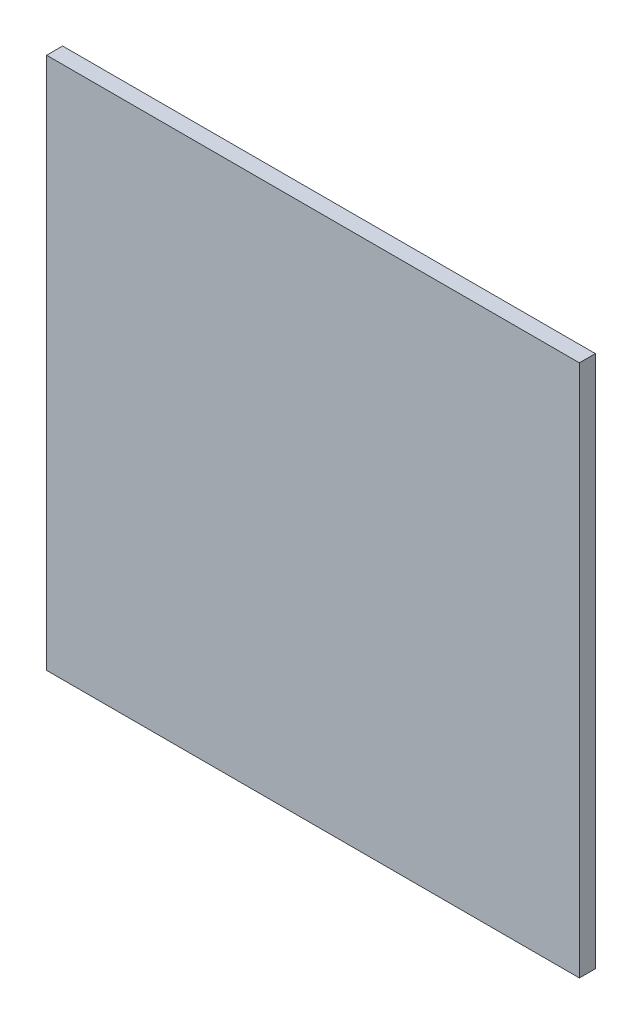
ISO-10303-21;
HEADER;
FILE_DESCRIPTION(('STEP AP214'),'2;1');
FILE_NAME('part.step','',(''),(''),'','','');
FILE_SCHEMA(('AUTOMOTIVE_DESIGN { 1 0 10303 214 1 1 1 1 }'));
ENDSEC;
DATA;
#1=APPLICATION_CONTEXT('core data for automotive mechanical design processes');
#2=APPLICATION_PROTOCOL_DEFINITION('international standard','automotive_design',2000,#1);
#3=PRODUCT_CONTEXT('',#1,'mechanical');
#4=PRODUCT('Part','Part','',(#3));
#5=PRODUCT_RELATED_PRODUCT_CATEGORY('part','',(#4));
#6=PRODUCT_DEFINITION_FORMATION('','',#4);
#7=PRODUCT_DEFINITION_CONTEXT('part definition',#1,'design');
#8=PRODUCT_DEFINITION('design','',#6,#7);
#9=PRODUCT_DEFINITION_SHAPE('','',#8);
#10=(LENGTH_UNIT() NAMED_UNIT(*) SI_UNIT(.MILLI.,.METRE.));
#11=(NAMED_UNIT(*) PLANE_ANGLE_UNIT() SI_UNIT($,.RADIAN.));
#12=(NAMED_UNIT(*) SI_UNIT($,.STERADIAN.) SOLID_ANGLE_UNIT());
#13=UNCERTAINTY_MEASURE_WITH_UNIT(LENGTH_MEASURE(1.E-05),#10,'distance_accuracy_value','');
#14=(GEOMETRIC_REPRESENTATION_CONTEXT(3) GLOBAL_UNCERTAINTY_ASSIGNED_CONTEXT((#13)) GLOBAL_UNIT_ASSIGNED_CONTEXT((#10,
#11,#12)) REPRESENTATION_CONTEXT('',''));
#15=CARTESIAN_POINT('',(0.,0.,0.));
#16=DIRECTION('',(0.,0.,1.));
#17=DIRECTION('',(1.,0.,0.));
#18=AXIS2_PLACEMENT_3D('',#15,#16,#17);
#19=CARTESIAN_POINT('',(50.,50.,3.));
#20=DIRECTION('',(-1.,0.,0.));
#21=DIRECTION('',(0.,-1.,0.));
#22=AXIS2_PLACEMENT_3D('',#19,#20,#21);
#23=PLANE('',#22);
#24=DIRECTION('',(0.,1.,0.));
#25=VECTOR('',#24,1.);
#26=CARTESIAN_POINT('',(50.,50.,0.));
#27=LINE('',#26,#25);
#28=CARTESIAN_POINT('',(50.,-50.,0.));
#29=VERTEX_POINT('',#28);
#30=CARTESIAN_POINT('',(50.,50.,0.));
#31=VERTEX_POINT('',#30);
#32=EDGE_CURVE('E100',#29,#31,#27,.T.);
#33=ORIENTED_EDGE('',*,*,#32,.T.);
#34=DIRECTION('',(0.,0.,-1.));
#35=VECTOR('',#34,1.);
#36=CARTESIAN_POINT('',(50.,50.,3.));
#37=LINE('',#36,#35);
#38=CARTESIAN_POINT('',(50.,50.,3.));
#39=VERTEX_POINT('',#38);
#40=EDGE_CURVE('E11',#39,#31,#37,.T.);
#41=ORIENTED_EDGE('',*,*,#40,.F.);
#42=DIRECTION('',(0.,1.,0.));
#43=VECTOR('',#42,1.);
#44=CARTESIAN_POINT('',(50.,50.,3.));
#45=LINE('',#44,#43);
#46=CARTESIAN_POINT('',(50.,-50.,3.));
#47=VERTEX_POINT('',#46);
#48=EDGE_CURVE('E88',#47,#39,#45,.T.);
#49=ORIENTED_EDGE('',*,*,#48,.F.);
#50=DIRECTION('',(0.,0.,-1.));
#51=VECTOR('',#50,1.);
#52=CARTESIAN_POINT('',(50.,-50.,3.));
#53=LINE('',#52,#51);
#54=EDGE_CURVE('E96',#47,#29,#53,.T.);
#55=ORIENTED_EDGE('',*,*,#54,.T.);
#56=EDGE_LOOP('',(#33,#41,#49,#55));
#57=FACE_BOUND('',#56,.T.);
#58=ADVANCED_FACE('F37',(#57),#23,.F.);
#59=CARTESIAN_POINT('',(-50.,50.,3.));
#60=DIRECTION('',(0.,-1.,0.));
#61=DIRECTION('',(0.,0.,-1.));
#62=AXIS2_PLACEMENT_3D('',#59,#60,#61);
#63=PLANE('',#62);
#64=DIRECTION('',(-1.,0.,0.));
#65=VECTOR('',#64,1.);
#66=CARTESIAN_POINT('',(-50.,50.,0.));
#67=LINE('',#66,#65);
#68=CARTESIAN_POINT('',(-50.,50.,0.));
#69=VERTEX_POINT('',#68);
#70=EDGE_CURVE('E92',#31,#69,#67,.T.);
#71=ORIENTED_EDGE('',*,*,#70,.T.);
#72=DIRECTION('',(0.,0.,-1.));
#73=VECTOR('',#72,1.);
#74=CARTESIAN_POINT('',(-50.,50.,3.));
#75=LINE('',#74,#73);
#76=CARTESIAN_POINT('',(-50.,50.,3.));
#77=VERTEX_POINT('',#76);
#78=EDGE_CURVE('E45',#77,#69,#75,.T.);
#79=ORIENTED_EDGE('',*,*,#78,.F.);
#80=DIRECTION('',(-1.,0.,0.));
#81=VECTOR('',#80,1.);
#82=CARTESIAN_POINT('',(-50.,50.,3.));
#83=LINE('',#82,#81);
#84=EDGE_CURVE('E83',#39,#77,#83,.T.);
#85=ORIENTED_EDGE('',*,*,#84,.F.);
#86=ORIENTED_EDGE('',*,*,#40,.T.);
#87=EDGE_LOOP('',(#71,#79,#85,#86));
#88=FACE_BOUND('',#87,.T.);
#89=ADVANCED_FACE('F91',(#88),#63,.F.);
#90=CARTESIAN_POINT('',(-50.,50.,3.));
#91=DIRECTION('',(1.,0.,0.));
#92=DIRECTION('',(0.,1.,0.));
#93=AXIS2_PLACEMENT_3D('',#90,#91,#92);
#94=PLANE('',#93);
#95=DIRECTION('',(0.,-1.,0.));
#96=VECTOR('',#95,1.);
#97=CARTESIAN_POINT('',(-50.,50.,0.));
#98=LINE('',#97,#96);
#99=CARTESIAN_POINT('',(-50.,-50.,0.));
#100=VERTEX_POINT('',#99);
#101=EDGE_CURVE('E70',#69,#100,#98,.T.);
#102=ORIENTED_EDGE('',*,*,#101,.T.);
#103=DIRECTION('',(0.,0.,-1.));
#104=VECTOR('',#103,1.);
#105=CARTESIAN_POINT('',(-50.,-50.,3.));
#106=LINE('',#105,#104);
#107=CARTESIAN_POINT('',(-50.,-50.,3.));
#108=VERTEX_POINT('',#107);
#109=EDGE_CURVE('E93',#108,#100,#106,.T.);
#110=ORIENTED_EDGE('',*,*,#109,.F.);
#111=DIRECTION('',(0.,-1.,0.));
#112=VECTOR('',#111,1.);
#113=CARTESIAN_POINT('',(-50.,50.,3.));
#114=LINE('',#113,#112);
#115=EDGE_CURVE('E86',#77,#108,#114,.T.);
#116=ORIENTED_EDGE('',*,*,#115,.F.);
#117=ORIENTED_EDGE('',*,*,#78,.T.);
#118=EDGE_LOOP('',(#102,#110,#116,#117));
#119=FACE_BOUND('',#118,.T.);
#120=ADVANCED_FACE('F94',(#119),#94,.F.);
#121=CARTESIAN_POINT('',(-50.,-50.,3.));
#122=DIRECTION('',(0.,1.,0.));
#123=DIRECTION('',(0.,0.,1.));
#124=AXIS2_PLACEMENT_3D('',#121,#122,#123);
#125=PLANE('',#124);
#126=DIRECTION('',(1.,0.,0.));
#127=VECTOR('',#126,1.);
#128=CARTESIAN_POINT('',(-50.,-50.,0.));
#129=LINE('',#128,#127);
#130=EDGE_CURVE('E76',#100,#29,#129,.T.);
#131=ORIENTED_EDGE('',*,*,#130,.T.);
#132=ORIENTED_EDGE('',*,*,#54,.F.);
#133=DIRECTION('',(1.,0.,0.));
#134=VECTOR('',#133,1.);
#135=CARTESIAN_POINT('',(-50.,-50.,3.));
#136=LINE('',#135,#134);
#137=EDGE_CURVE('E53',#108,#47,#136,.T.);
#138=ORIENTED_EDGE('',*,*,#137,.F.);
#139=ORIENTED_EDGE('',*,*,#109,.T.);
#140=EDGE_LOOP('',(#131,#132,#138,#139));
#141=FACE_BOUND('',#140,.T.);
#142=ADVANCED_FACE('F107',(#141),#125,.F.);
#143=CARTESIAN_POINT('',(0.,0.,3.));
#144=DIRECTION('',(0.,0.,1.));
#145=DIRECTION('',(1.,0.,0.));
#146=AXIS2_PLACEMENT_3D('',#143,#144,#145);
#147=PLANE('',#146);
#148=ORIENTED_EDGE('',*,*,#48,.T.);
#149=ORIENTED_EDGE('',*,*,#84,.T.);
#150=ORIENTED_EDGE('',*,*,#115,.T.);
#151=ORIENTED_EDGE('',*,*,#137,.T.);
#152=EDGE_LOOP('',(#148,#149,#150,#151));
#153=FACE_BOUND('',#152,.T.);
#154=ADVANCED_FACE('F84',(#153),#147,.T.);
#155=CARTESIAN_POINT('',(0.,0.,0.));
#156=DIRECTION('',(0.,0.,1.));
#157=DIRECTION('',(1.,0.,0.));
#158=AXIS2_PLACEMENT_3D('',#155,#156,#157);
#159=PLANE('',#158);
#160=ORIENTED_EDGE('',*,*,#32,.F.);
#161=ORIENTED_EDGE('',*,*,#130,.F.);
#162=ORIENTED_EDGE('',*,*,#101,.F.);
#163=ORIENTED_EDGE('',*,*,#70,.F.);
#164=EDGE_LOOP('',(#160,#161,#162,#163));
#165=FACE_BOUND('',#164,.T.);
#166=ADVANCED_FACE('F110',(#165),#159,.F.);
#167=CLOSED_SHELL('',(#58,#89,#120,#142,#154,#166));
#168=MANIFOLD_SOLID_BREP('B2',#167);
#169=ADVANCED_BREP_SHAPE_REPRESENTATION('',(#18,#168),#14);
#170=SHAPE_DEFINITION_REPRESENTATION(#9,#169);
ENDSEC;
END-ISO-10303-21;
